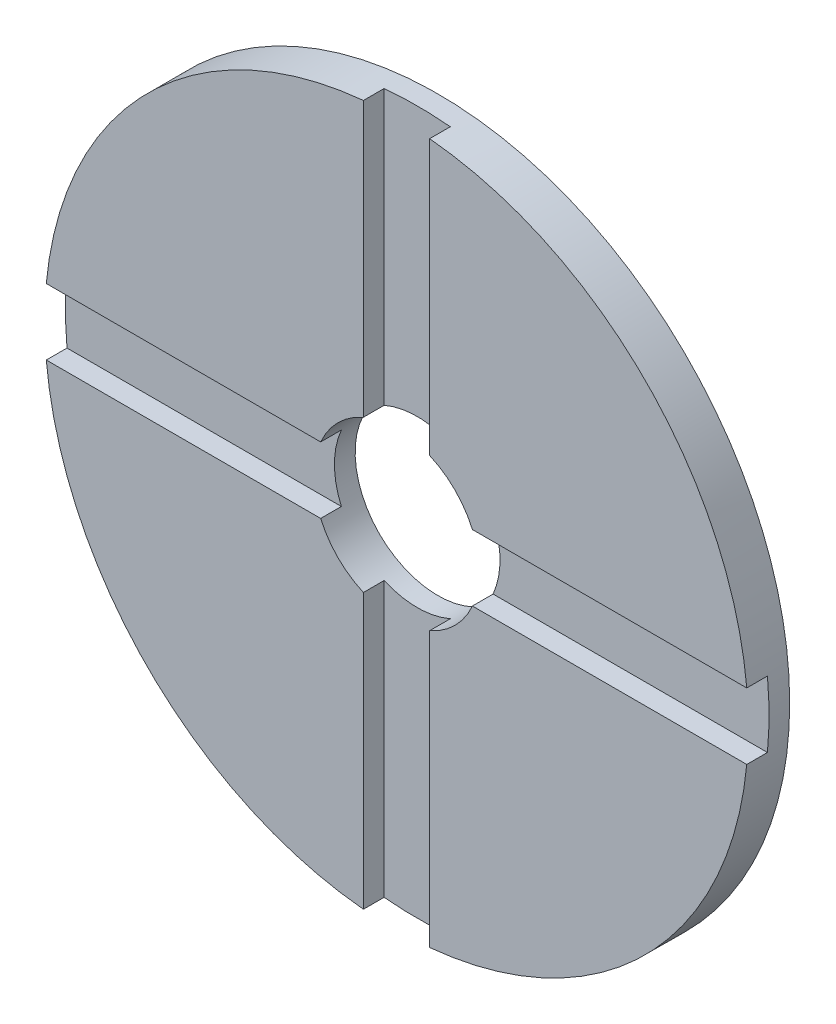
ISO-10303-21;
HEADER;
FILE_DESCRIPTION(('STEP AP214'),'2;1');
FILE_NAME('part.step','',(''),(''),'','','');
FILE_SCHEMA(('AUTOMOTIVE_DESIGN { 1 0 10303 214 1 1 1 1 }'));
ENDSEC;
DATA;
#1=APPLICATION_CONTEXT('core data for automotive mechanical design processes');
#2=APPLICATION_PROTOCOL_DEFINITION('international standard','automotive_design',2000,#1);
#3=PRODUCT_CONTEXT('',#1,'mechanical');
#4=PRODUCT('Part','Part','',(#3));
#5=PRODUCT_RELATED_PRODUCT_CATEGORY('part','',(#4));
#6=PRODUCT_DEFINITION_FORMATION('','',#4);
#7=PRODUCT_DEFINITION_CONTEXT('part definition',#1,'design');
#8=PRODUCT_DEFINITION('design','',#6,#7);
#9=PRODUCT_DEFINITION_SHAPE('','',#8);
#10=(LENGTH_UNIT() NAMED_UNIT(*) SI_UNIT(.MILLI.,.METRE.));
#11=(NAMED_UNIT(*) PLANE_ANGLE_UNIT() SI_UNIT($,.RADIAN.));
#12=(NAMED_UNIT(*) SI_UNIT($,.STERADIAN.) SOLID_ANGLE_UNIT());
#13=UNCERTAINTY_MEASURE_WITH_UNIT(LENGTH_MEASURE(1.E-05),#10,'distance_accuracy_value','');
#14=(GEOMETRIC_REPRESENTATION_CONTEXT(3) GLOBAL_UNCERTAINTY_ASSIGNED_CONTEXT((#13)) GLOBAL_UNIT_ASSIGNED_CONTEXT((#10,
#11,#12)) REPRESENTATION_CONTEXT('',''));
#15=CARTESIAN_POINT('',(0.,0.,0.));
#16=DIRECTION('',(0.,0.,1.));
#17=DIRECTION('',(1.,0.,0.));
#18=AXIS2_PLACEMENT_3D('',#15,#16,#17);
#19=CARTESIAN_POINT('',(0.,0.,10.));
#20=DIRECTION('',(0.,0.,-1.));
#21=DIRECTION('',(-1.,0.,0.));
#22=AXIS2_PLACEMENT_3D('',#19,#20,#21);
#23=CYLINDRICAL_SURFACE('',#22,20.);
#24=CARTESIAN_POINT('',(0.,0.,0.));
#25=DIRECTION('',(0.,0.,1.));
#26=DIRECTION('',(1.,0.,0.));
#27=AXIS2_PLACEMENT_3D('',#24,#25,#26);
#28=CIRCLE('',#27,20.);
#29=CARTESIAN_POINT('',(20.,0.,0.));
#30=VERTEX_POINT('',#29);
#31=EDGE_CURVE('E266',#30,#30,#28,.T.);
#32=ORIENTED_EDGE('',*,*,#31,.F.);
#33=EDGE_LOOP('',(#32));
#34=FACE_BOUND('',#33,.T.);
#35=CARTESIAN_POINT('',(0.,0.,10.));
#36=DIRECTION('',(0.,0.,1.));
#37=DIRECTION('',(1.,0.,0.));
#38=AXIS2_PLACEMENT_3D('',#35,#36,#37);
#39=CIRCLE('',#38,20.);
#40=CARTESIAN_POINT('',(-7.99999999999998,18.3303027798234,10.));
#41=VERTEX_POINT('',#40);
#42=CARTESIAN_POINT('',(-18.3303027798234,7.99999999999999,10.));
#43=VERTEX_POINT('',#42);
#44=EDGE_CURVE('E264',#41,#43,#39,.T.);
#45=ORIENTED_EDGE('',*,*,#44,.T.);
#46=DIRECTION('',(0.,0.,1.));
#47=VECTOR('',#46,1.);
#48=CARTESIAN_POINT('',(-18.3303027798234,7.99999999999999,5.));
#49=LINE('',#48,#47);
#50=CARTESIAN_POINT('',(-18.3303027798234,7.99999999999999,5.));
#51=VERTEX_POINT('',#50);
#52=EDGE_CURVE('E180',#51,#43,#49,.T.);
#53=ORIENTED_EDGE('',*,*,#52,.F.);
#54=CARTESIAN_POINT('',(0.,0.,5.));
#55=DIRECTION('',(0.,0.,1.));
#56=DIRECTION('',(1.,0.,0.));
#57=AXIS2_PLACEMENT_3D('',#54,#55,#56);
#58=CIRCLE('',#57,20.);
#59=CARTESIAN_POINT('',(-18.3303027798234,-7.99999999999999,5.));
#60=VERTEX_POINT('',#59);
#61=EDGE_CURVE('E163',#60,#51,#58,.F.);
#62=ORIENTED_EDGE('',*,*,#61,.F.);
#63=DIRECTION('',(0.,0.,1.));
#64=VECTOR('',#63,1.);
#65=CARTESIAN_POINT('',(-18.3303027798234,-7.99999999999999,5.));
#66=LINE('',#65,#64);
#67=CARTESIAN_POINT('',(-18.3303027798234,-7.99999999999999,10.));
#68=VERTEX_POINT('',#67);
#69=EDGE_CURVE('E159',#60,#68,#66,.T.);
#70=ORIENTED_EDGE('',*,*,#69,.T.);
#71=CARTESIAN_POINT('',(-7.99999999999998,-18.3303027798234,10.));
#72=VERTEX_POINT('',#71);
#73=EDGE_CURVE('E308',#68,#72,#39,.T.);
#74=ORIENTED_EDGE('',*,*,#73,.T.);
#75=DIRECTION('',(0.,0.,1.));
#76=VECTOR('',#75,1.);
#77=CARTESIAN_POINT('',(-7.99999999999998,-18.3303027798234,5.));
#78=LINE('',#77,#76);
#79=CARTESIAN_POINT('',(-7.99999999999998,-18.3303027798234,5.));
#80=VERTEX_POINT('',#79);
#81=EDGE_CURVE('E258',#80,#72,#78,.T.);
#82=ORIENTED_EDGE('',*,*,#81,.F.);
#83=CARTESIAN_POINT('',(0.,0.,5.));
#84=DIRECTION('',(0.,0.,1.));
#85=DIRECTION('',(1.,0.,0.));
#86=AXIS2_PLACEMENT_3D('',#83,#84,#85);
#87=CIRCLE('',#86,20.);
#88=CARTESIAN_POINT('',(8.00000000000001,-18.3303027798234,5.));
#89=VERTEX_POINT('',#88);
#90=EDGE_CURVE('E240',#89,#80,#87,.F.);
#91=ORIENTED_EDGE('',*,*,#90,.F.);
#92=DIRECTION('',(0.,0.,1.));
#93=VECTOR('',#92,1.);
#94=CARTESIAN_POINT('',(8.00000000000001,-18.3303027798234,5.));
#95=LINE('',#94,#93);
#96=CARTESIAN_POINT('',(8.00000000000001,-18.3303027798234,10.));
#97=VERTEX_POINT('',#96);
#98=EDGE_CURVE('E250',#89,#97,#95,.T.);
#99=ORIENTED_EDGE('',*,*,#98,.T.);
#100=CARTESIAN_POINT('',(18.3303027798234,-7.99999999999999,10.));
#101=VERTEX_POINT('',#100);
#102=EDGE_CURVE('E265',#97,#101,#39,.T.);
#103=ORIENTED_EDGE('',*,*,#102,.T.);
#104=DIRECTION('',(0.,0.,1.));
#105=VECTOR('',#104,1.);
#106=CARTESIAN_POINT('',(18.3303027798234,-7.99999999999999,5.));
#107=LINE('',#106,#105);
#108=CARTESIAN_POINT('',(18.3303027798234,-7.99999999999999,5.));
#109=VERTEX_POINT('',#108);
#110=EDGE_CURVE('E197',#109,#101,#107,.T.);
#111=ORIENTED_EDGE('',*,*,#110,.F.);
#112=CARTESIAN_POINT('',(0.,0.,5.));
#113=DIRECTION('',(0.,0.,1.));
#114=DIRECTION('',(1.,0.,0.));
#115=AXIS2_PLACEMENT_3D('',#112,#113,#114);
#116=CIRCLE('',#115,20.);
#117=CARTESIAN_POINT('',(18.3303027798234,7.99999999999999,5.));
#118=VERTEX_POINT('',#117);
#119=EDGE_CURVE('E185',#118,#109,#116,.F.);
#120=ORIENTED_EDGE('',*,*,#119,.F.);
#121=DIRECTION('',(0.,0.,1.));
#122=VECTOR('',#121,1.);
#123=CARTESIAN_POINT('',(18.3303027798234,7.99999999999999,5.));
#124=LINE('',#123,#122);
#125=CARTESIAN_POINT('',(18.3303027798234,7.99999999999999,10.));
#126=VERTEX_POINT('',#125);
#127=EDGE_CURVE('E203',#118,#126,#124,.T.);
#128=ORIENTED_EDGE('',*,*,#127,.T.);
#129=CARTESIAN_POINT('',(7.99999999999999,18.3303027798234,10.));
#130=VERTEX_POINT('',#129);
#131=EDGE_CURVE('E262',#126,#130,#39,.T.);
#132=ORIENTED_EDGE('',*,*,#131,.T.);
#133=DIRECTION('',(0.,0.,1.));
#134=VECTOR('',#133,1.);
#135=CARTESIAN_POINT('',(7.99999999999999,18.3303027798234,5.));
#136=LINE('',#135,#134);
#137=CARTESIAN_POINT('',(7.99999999999999,18.3303027798234,5.));
#138=VERTEX_POINT('',#137);
#139=EDGE_CURVE('E200',#138,#130,#136,.T.);
#140=ORIENTED_EDGE('',*,*,#139,.F.);
#141=CARTESIAN_POINT('',(0.,0.,5.));
#142=DIRECTION('',(0.,0.,1.));
#143=DIRECTION('',(1.,0.,0.));
#144=AXIS2_PLACEMENT_3D('',#141,#142,#143);
#145=CIRCLE('',#144,20.);
#146=CARTESIAN_POINT('',(-7.99999999999998,18.3303027798234,5.));
#147=VERTEX_POINT('',#146);
#148=EDGE_CURVE('E222',#147,#138,#145,.F.);
#149=ORIENTED_EDGE('',*,*,#148,.F.);
#150=DIRECTION('',(0.,0.,1.));
#151=VECTOR('',#150,1.);
#152=CARTESIAN_POINT('',(-7.99999999999998,18.3303027798234,5.));
#153=LINE('',#152,#151);
#154=EDGE_CURVE('E232',#147,#41,#153,.T.);
#155=ORIENTED_EDGE('',*,*,#154,.T.);
#156=EDGE_LOOP('',(#45,#53,#62,#70,#74,#82,#91,#99,#103,#111,#120,#128,#132,#140,#149,#155));
#157=FACE_BOUND('',#156,.T.);
#158=ADVANCED_FACE('F42',(#34,#157),#23,.F.);
#159=CARTESIAN_POINT('',(0.,0.,10.));
#160=DIRECTION('',(0.,0.,-1.));
#161=DIRECTION('',(-1.,0.,0.));
#162=AXIS2_PLACEMENT_3D('',#159,#160,#161);
#163=CYLINDRICAL_SURFACE('',#162,85.);
#164=CARTESIAN_POINT('',(0.,0.,0.));
#165=DIRECTION('',(0.,0.,1.));
#166=DIRECTION('',(1.,0.,0.));
#167=AXIS2_PLACEMENT_3D('',#164,#165,#166);
#168=CIRCLE('',#167,85.);
#169=CARTESIAN_POINT('',(85.,0.,0.));
#170=VERTEX_POINT('',#169);
#171=EDGE_CURVE('E45',#170,#170,#168,.T.);
#172=ORIENTED_EDGE('',*,*,#171,.T.);
#173=EDGE_LOOP('',(#172));
#174=FACE_BOUND('',#173,.T.);
#175=DIRECTION('',(0.,0.,1.));
#176=VECTOR('',#175,1.);
#177=CARTESIAN_POINT('',(-84.6226919921601,8.,5.));
#178=LINE('',#177,#176);
#179=CARTESIAN_POINT('',(-84.6226919921601,8.,5.));
#180=VERTEX_POINT('',#179);
#181=CARTESIAN_POINT('',(-84.6226919921601,8.,10.));
#182=VERTEX_POINT('',#181);
#183=EDGE_CURVE('E268',#180,#182,#178,.T.);
#184=ORIENTED_EDGE('',*,*,#183,.T.);
#185=CARTESIAN_POINT('',(0.,0.,10.));
#186=DIRECTION('',(0.,0.,1.));
#187=DIRECTION('',(1.,0.,0.));
#188=AXIS2_PLACEMENT_3D('',#185,#186,#187);
#189=CIRCLE('',#188,85.);
#190=CARTESIAN_POINT('',(-7.99999999999998,84.6226919921601,10.));
#191=VERTEX_POINT('',#190);
#192=EDGE_CURVE('E50',#191,#182,#189,.T.);
#193=ORIENTED_EDGE('',*,*,#192,.F.);
#194=DIRECTION('',(0.,0.,1.));
#195=VECTOR('',#194,1.);
#196=CARTESIAN_POINT('',(-7.99999999999998,84.6226919921601,5.));
#197=LINE('',#196,#195);
#198=CARTESIAN_POINT('',(-7.99999999999998,84.6226919921601,5.));
#199=VERTEX_POINT('',#198);
#200=EDGE_CURVE('E67',#199,#191,#197,.T.);
#201=ORIENTED_EDGE('',*,*,#200,.F.);
#202=CARTESIAN_POINT('',(0.,0.,5.));
#203=DIRECTION('',(0.,0.,1.));
#204=DIRECTION('',(1.,0.,0.));
#205=AXIS2_PLACEMENT_3D('',#202,#203,#204);
#206=CIRCLE('',#205,85.);
#207=CARTESIAN_POINT('',(7.99999999999998,84.6226919921601,5.));
#208=VERTEX_POINT('',#207);
#209=EDGE_CURVE('E215',#208,#199,#206,.T.);
#210=ORIENTED_EDGE('',*,*,#209,.F.);
#211=DIRECTION('',(0.,0.,1.));
#212=VECTOR('',#211,1.);
#213=CARTESIAN_POINT('',(7.99999999999998,84.6226919921601,5.));
#214=LINE('',#213,#212);
#215=CARTESIAN_POINT('',(7.99999999999998,84.6226919921601,10.));
#216=VERTEX_POINT('',#215);
#217=EDGE_CURVE('E225',#208,#216,#214,.T.);
#218=ORIENTED_EDGE('',*,*,#217,.T.);
#219=CARTESIAN_POINT('',(84.6226919921601,7.99999999999998,10.));
#220=VERTEX_POINT('',#219);
#221=EDGE_CURVE('E12',#220,#216,#189,.T.);
#222=ORIENTED_EDGE('',*,*,#221,.F.);
#223=DIRECTION('',(0.,0.,1.));
#224=VECTOR('',#223,1.);
#225=CARTESIAN_POINT('',(84.6226919921601,7.99999999999998,5.));
#226=LINE('',#225,#224);
#227=CARTESIAN_POINT('',(84.6226919921601,7.99999999999998,5.));
#228=VERTEX_POINT('',#227);
#229=EDGE_CURVE('E207',#228,#220,#226,.T.);
#230=ORIENTED_EDGE('',*,*,#229,.F.);
#231=CARTESIAN_POINT('',(0.,0.,5.));
#232=DIRECTION('',(0.,0.,1.));
#233=DIRECTION('',(1.,0.,0.));
#234=AXIS2_PLACEMENT_3D('',#231,#232,#233);
#235=CIRCLE('',#234,85.);
#236=CARTESIAN_POINT('',(84.6226919921601,-7.99999999999998,5.));
#237=VERTEX_POINT('',#236);
#238=EDGE_CURVE('E192',#237,#228,#235,.T.);
#239=ORIENTED_EDGE('',*,*,#238,.F.);
#240=DIRECTION('',(0.,0.,1.));
#241=VECTOR('',#240,1.);
#242=CARTESIAN_POINT('',(84.6226919921601,-7.99999999999998,5.));
#243=LINE('',#242,#241);
#244=CARTESIAN_POINT('',(84.6226919921601,-7.99999999999998,10.));
#245=VERTEX_POINT('',#244);
#246=EDGE_CURVE('E209',#237,#245,#243,.T.);
#247=ORIENTED_EDGE('',*,*,#246,.T.);
#248=CARTESIAN_POINT('',(8.00000000000002,-84.6226919921601,10.));
#249=VERTEX_POINT('',#248);
#250=EDGE_CURVE('E52',#249,#245,#189,.T.);
#251=ORIENTED_EDGE('',*,*,#250,.F.);
#252=DIRECTION('',(0.,0.,1.));
#253=VECTOR('',#252,1.);
#254=CARTESIAN_POINT('',(8.00000000000002,-84.6226919921601,5.));
#255=LINE('',#254,#253);
#256=CARTESIAN_POINT('',(8.00000000000002,-84.6226919921601,5.));
#257=VERTEX_POINT('',#256);
#258=EDGE_CURVE('E229',#257,#249,#255,.T.);
#259=ORIENTED_EDGE('',*,*,#258,.F.);
#260=CARTESIAN_POINT('',(0.,0.,5.));
#261=DIRECTION('',(0.,0.,1.));
#262=DIRECTION('',(1.,0.,0.));
#263=AXIS2_PLACEMENT_3D('',#260,#261,#262);
#264=CIRCLE('',#263,85.);
#265=CARTESIAN_POINT('',(-7.99999999999998,-84.6226919921601,5.));
#266=VERTEX_POINT('',#265);
#267=EDGE_CURVE('E247',#266,#257,#264,.T.);
#268=ORIENTED_EDGE('',*,*,#267,.F.);
#269=DIRECTION('',(0.,0.,1.));
#270=VECTOR('',#269,1.);
#271=CARTESIAN_POINT('',(-7.99999999999998,-84.6226919921601,5.));
#272=LINE('',#271,#270);
#273=CARTESIAN_POINT('',(-7.99999999999998,-84.6226919921601,10.));
#274=VERTEX_POINT('',#273);
#275=EDGE_CURVE('E256',#266,#274,#272,.T.);
#276=ORIENTED_EDGE('',*,*,#275,.T.);
#277=CARTESIAN_POINT('',(-84.6226919921601,-8.,10.));
#278=VERTEX_POINT('',#277);
#279=EDGE_CURVE('E178',#278,#274,#189,.T.);
#280=ORIENTED_EDGE('',*,*,#279,.F.);
#281=DIRECTION('',(0.,0.,1.));
#282=VECTOR('',#281,1.);
#283=CARTESIAN_POINT('',(-84.6226919921601,-8.,5.));
#284=LINE('',#283,#282);
#285=CARTESIAN_POINT('',(-84.6226919921601,-8.,5.));
#286=VERTEX_POINT('',#285);
#287=EDGE_CURVE('E59',#286,#278,#284,.T.);
#288=ORIENTED_EDGE('',*,*,#287,.F.);
#289=CARTESIAN_POINT('',(0.,0.,5.));
#290=DIRECTION('',(0.,0.,1.));
#291=DIRECTION('',(1.,0.,0.));
#292=AXIS2_PLACEMENT_3D('',#289,#290,#291);
#293=CIRCLE('',#292,85.);
#294=EDGE_CURVE('E164',#180,#286,#293,.T.);
#295=ORIENTED_EDGE('',*,*,#294,.F.);
#296=EDGE_LOOP('',(#184,#193,#201,#210,#218,#222,#230,#239,#247,#251,#259,#268,#276,#280,#288,#295));
#297=FACE_BOUND('',#296,.T.);
#298=ADVANCED_FACE('F175',(#174,#297),#163,.T.);
#299=CARTESIAN_POINT('',(0.,0.,10.));
#300=DIRECTION('',(0.,0.,1.));
#301=DIRECTION('',(1.,0.,0.));
#302=AXIS2_PLACEMENT_3D('',#299,#300,#301);
#303=PLANE('',#302);
#304=ORIENTED_EDGE('',*,*,#192,.T.);
#305=DIRECTION('',(1.,0.,0.));
#306=VECTOR('',#305,1.);
#307=CARTESIAN_POINT('',(0.,7.99999999999999,10.));
#308=LINE('',#307,#306);
#309=EDGE_CURVE('E172',#182,#43,#308,.T.);
#310=ORIENTED_EDGE('',*,*,#309,.T.);
#311=ORIENTED_EDGE('',*,*,#44,.F.);
#312=DIRECTION('',(0.,-1.,0.));
#313=VECTOR('',#312,1.);
#314=CARTESIAN_POINT('',(-7.99999999999998,0.,10.));
#315=LINE('',#314,#313);
#316=EDGE_CURVE('E216',#191,#41,#315,.T.);
#317=ORIENTED_EDGE('',*,*,#316,.F.);
#318=EDGE_LOOP('',(#304,#310,#311,#317));
#319=FACE_BOUND('',#318,.T.);
#320=ADVANCED_FACE('F286',(#319),#303,.T.);
#321=ORIENTED_EDGE('',*,*,#131,.F.);
#322=DIRECTION('',(1.,0.,0.));
#323=VECTOR('',#322,1.);
#324=CARTESIAN_POINT('',(0.,7.99999999999999,10.));
#325=LINE('',#324,#323);
#326=EDGE_CURVE('E189',#126,#220,#325,.T.);
#327=ORIENTED_EDGE('',*,*,#326,.T.);
#328=ORIENTED_EDGE('',*,*,#221,.T.);
#329=DIRECTION('',(0.,-1.,0.));
#330=VECTOR('',#329,1.);
#331=CARTESIAN_POINT('',(8.,0.,10.));
#332=LINE('',#331,#330);
#333=EDGE_CURVE('E226',#216,#130,#332,.T.);
#334=ORIENTED_EDGE('',*,*,#333,.T.);
#335=EDGE_LOOP('',(#321,#327,#328,#334));
#336=FACE_BOUND('',#335,.T.);
#337=ADVANCED_FACE('F340',(#336),#303,.T.);
#338=DIRECTION('',(1.,0.,0.));
#339=VECTOR('',#338,1.);
#340=CARTESIAN_POINT('',(0.,-7.99999999999999,10.));
#341=LINE('',#340,#339);
#342=EDGE_CURVE('E198',#101,#245,#341,.T.);
#343=ORIENTED_EDGE('',*,*,#342,.F.);
#344=ORIENTED_EDGE('',*,*,#102,.F.);
#345=DIRECTION('',(0.,-1.,0.));
#346=VECTOR('',#345,1.);
#347=CARTESIAN_POINT('',(8.,0.,10.));
#348=LINE('',#347,#346);
#349=EDGE_CURVE('E251',#97,#249,#348,.T.);
#350=ORIENTED_EDGE('',*,*,#349,.T.);
#351=ORIENTED_EDGE('',*,*,#250,.T.);
#352=EDGE_LOOP('',(#343,#344,#350,#351));
#353=FACE_BOUND('',#352,.T.);
#354=ADVANCED_FACE('F293',(#353),#303,.T.);
#355=DIRECTION('',(1.,0.,0.));
#356=VECTOR('',#355,1.);
#357=CARTESIAN_POINT('',(0.,-7.99999999999999,10.));
#358=LINE('',#357,#356);
#359=EDGE_CURVE('E206',#278,#68,#358,.T.);
#360=ORIENTED_EDGE('',*,*,#359,.F.);
#361=ORIENTED_EDGE('',*,*,#279,.T.);
#362=DIRECTION('',(0.,-1.,0.));
#363=VECTOR('',#362,1.);
#364=CARTESIAN_POINT('',(-7.99999999999998,0.,10.));
#365=LINE('',#364,#363);
#366=EDGE_CURVE('E241',#72,#274,#365,.T.);
#367=ORIENTED_EDGE('',*,*,#366,.F.);
#368=ORIENTED_EDGE('',*,*,#73,.F.);
#369=EDGE_LOOP('',(#360,#361,#367,#368));
#370=FACE_BOUND('',#369,.T.);
#371=ADVANCED_FACE('F312',(#370),#303,.T.);
#372=CARTESIAN_POINT('',(0.,0.,0.));
#373=DIRECTION('',(0.,0.,1.));
#374=DIRECTION('',(1.,0.,0.));
#375=AXIS2_PLACEMENT_3D('',#372,#373,#374);
#376=PLANE('',#375);
#377=ORIENTED_EDGE('',*,*,#31,.T.);
#378=EDGE_LOOP('',(#377));
#379=FACE_BOUND('',#378,.T.);
#380=ORIENTED_EDGE('',*,*,#171,.F.);
#381=EDGE_LOOP('',(#380));
#382=FACE_BOUND('',#381,.T.);
#383=ADVANCED_FACE('F321',(#379,#382),#376,.F.);
#384=CARTESIAN_POINT('',(8.,0.,5.));
#385=DIRECTION('',(-1.,0.,0.));
#386=DIRECTION('',(0.,-1.,0.));
#387=AXIS2_PLACEMENT_3D('',#384,#385,#386);
#388=PLANE('',#387);
#389=ORIENTED_EDGE('',*,*,#349,.F.);
#390=ORIENTED_EDGE('',*,*,#98,.F.);
#391=DIRECTION('',(0.,-1.,0.));
#392=VECTOR('',#391,1.);
#393=CARTESIAN_POINT('',(8.,0.,5.));
#394=LINE('',#393,#392);
#395=EDGE_CURVE('E238',#89,#257,#394,.T.);
#396=ORIENTED_EDGE('',*,*,#395,.T.);
#397=ORIENTED_EDGE('',*,*,#258,.T.);
#398=EDGE_LOOP('',(#389,#390,#396,#397));
#399=FACE_BOUND('',#398,.T.);
#400=ADVANCED_FACE('F319',(#399),#388,.T.);
#401=CARTESIAN_POINT('',(-7.99999999999998,0.,5.));
#402=DIRECTION('',(-1.,0.,0.));
#403=DIRECTION('',(0.,0.,1.));
#404=AXIS2_PLACEMENT_3D('',#401,#402,#403);
#405=PLANE('',#404);
#406=ORIENTED_EDGE('',*,*,#366,.T.);
#407=ORIENTED_EDGE('',*,*,#275,.F.);
#408=DIRECTION('',(0.,-1.,0.));
#409=VECTOR('',#408,1.);
#410=CARTESIAN_POINT('',(-7.99999999999998,0.,5.));
#411=LINE('',#410,#409);
#412=EDGE_CURVE('E244',#80,#266,#411,.T.);
#413=ORIENTED_EDGE('',*,*,#412,.F.);
#414=ORIENTED_EDGE('',*,*,#81,.T.);
#415=EDGE_LOOP('',(#406,#407,#413,#414));
#416=FACE_BOUND('',#415,.T.);
#417=ADVANCED_FACE('F314',(#416),#405,.F.);
#418=CARTESIAN_POINT('',(0.,0.,5.));
#419=DIRECTION('',(0.,0.,1.));
#420=DIRECTION('',(1.,0.,0.));
#421=AXIS2_PLACEMENT_3D('',#418,#419,#420);
#422=PLANE('',#421);
#423=ORIENTED_EDGE('',*,*,#395,.F.);
#424=ORIENTED_EDGE('',*,*,#90,.T.);
#425=ORIENTED_EDGE('',*,*,#412,.T.);
#426=ORIENTED_EDGE('',*,*,#267,.T.);
#427=EDGE_LOOP('',(#423,#424,#425,#426));
#428=FACE_BOUND('',#427,.T.);
#429=ADVANCED_FACE('F317',(#428),#422,.T.);
#430=CARTESIAN_POINT('',(8.,0.,5.));
#431=DIRECTION('',(-1.,0.,0.));
#432=DIRECTION('',(0.,-1.,0.));
#433=AXIS2_PLACEMENT_3D('',#430,#431,#432);
#434=PLANE('',#433);
#435=ORIENTED_EDGE('',*,*,#333,.F.);
#436=ORIENTED_EDGE('',*,*,#217,.F.);
#437=DIRECTION('',(0.,-1.,0.));
#438=VECTOR('',#437,1.);
#439=CARTESIAN_POINT('',(8.,0.,5.));
#440=LINE('',#439,#438);
#441=EDGE_CURVE('E213',#208,#138,#440,.T.);
#442=ORIENTED_EDGE('',*,*,#441,.T.);
#443=ORIENTED_EDGE('',*,*,#139,.T.);
#444=EDGE_LOOP('',(#435,#436,#442,#443));
#445=FACE_BOUND('',#444,.T.);
#446=ADVANCED_FACE('F386',(#445),#434,.T.);
#447=CARTESIAN_POINT('',(-7.99999999999998,0.,5.));
#448=DIRECTION('',(-1.,0.,0.));
#449=DIRECTION('',(0.,0.,1.));
#450=AXIS2_PLACEMENT_3D('',#447,#448,#449);
#451=PLANE('',#450);
#452=ORIENTED_EDGE('',*,*,#316,.T.);
#453=ORIENTED_EDGE('',*,*,#154,.F.);
#454=DIRECTION('',(0.,-1.,0.));
#455=VECTOR('',#454,1.);
#456=CARTESIAN_POINT('',(-7.99999999999998,0.,5.));
#457=LINE('',#456,#455);
#458=EDGE_CURVE('E219',#199,#147,#457,.T.);
#459=ORIENTED_EDGE('',*,*,#458,.F.);
#460=ORIENTED_EDGE('',*,*,#200,.T.);
#461=EDGE_LOOP('',(#452,#453,#459,#460));
#462=FACE_BOUND('',#461,.T.);
#463=ADVANCED_FACE('F394',(#462),#451,.F.);
#464=CARTESIAN_POINT('',(0.,0.,5.));
#465=DIRECTION('',(0.,0.,1.));
#466=DIRECTION('',(1.,0.,0.));
#467=AXIS2_PLACEMENT_3D('',#464,#465,#466);
#468=PLANE('',#467);
#469=ORIENTED_EDGE('',*,*,#441,.F.);
#470=ORIENTED_EDGE('',*,*,#209,.T.);
#471=ORIENTED_EDGE('',*,*,#458,.T.);
#472=ORIENTED_EDGE('',*,*,#148,.T.);
#473=EDGE_LOOP('',(#469,#470,#471,#472));
#474=FACE_BOUND('',#473,.T.);
#475=ADVANCED_FACE('F403',(#474),#468,.T.);
#476=CARTESIAN_POINT('',(0.,7.99999999999999,5.));
#477=DIRECTION('',(0.,-1.,0.));
#478=DIRECTION('',(1.,0.,0.));
#479=AXIS2_PLACEMENT_3D('',#476,#477,#478);
#480=PLANE('',#479);
#481=ORIENTED_EDGE('',*,*,#326,.F.);
#482=ORIENTED_EDGE('',*,*,#127,.F.);
#483=DIRECTION('',(1.,0.,0.));
#484=VECTOR('',#483,1.);
#485=CARTESIAN_POINT('',(0.,7.99999999999999,5.));
#486=LINE('',#485,#484);
#487=EDGE_CURVE('E195',#118,#228,#486,.T.);
#488=ORIENTED_EDGE('',*,*,#487,.T.);
#489=ORIENTED_EDGE('',*,*,#229,.T.);
#490=EDGE_LOOP('',(#481,#482,#488,#489));
#491=FACE_BOUND('',#490,.T.);
#492=ADVANCED_FACE('F411',(#491),#480,.T.);
#493=CARTESIAN_POINT('',(0.,-7.99999999999999,5.));
#494=DIRECTION('',(0.,-1.,0.));
#495=DIRECTION('',(1.,0.,0.));
#496=AXIS2_PLACEMENT_3D('',#493,#494,#495);
#497=PLANE('',#496);
#498=ORIENTED_EDGE('',*,*,#342,.T.);
#499=ORIENTED_EDGE('',*,*,#246,.F.);
#500=DIRECTION('',(1.,0.,0.));
#501=VECTOR('',#500,1.);
#502=CARTESIAN_POINT('',(0.,-7.99999999999999,5.));
#503=LINE('',#502,#501);
#504=EDGE_CURVE('E188',#109,#237,#503,.T.);
#505=ORIENTED_EDGE('',*,*,#504,.F.);
#506=ORIENTED_EDGE('',*,*,#110,.T.);
#507=EDGE_LOOP('',(#498,#499,#505,#506));
#508=FACE_BOUND('',#507,.T.);
#509=ADVANCED_FACE('F301',(#508),#497,.F.);
#510=CARTESIAN_POINT('',(0.,0.,5.));
#511=DIRECTION('',(0.,0.,1.));
#512=DIRECTION('',(1.,0.,0.));
#513=AXIS2_PLACEMENT_3D('',#510,#511,#512);
#514=PLANE('',#513);
#515=ORIENTED_EDGE('',*,*,#119,.T.);
#516=ORIENTED_EDGE('',*,*,#504,.T.);
#517=ORIENTED_EDGE('',*,*,#238,.T.);
#518=ORIENTED_EDGE('',*,*,#487,.F.);
#519=EDGE_LOOP('',(#515,#516,#517,#518));
#520=FACE_BOUND('',#519,.T.);
#521=ADVANCED_FACE('F303',(#520),#514,.T.);
#522=CARTESIAN_POINT('',(0.,7.99999999999999,5.));
#523=DIRECTION('',(0.,-1.,0.));
#524=DIRECTION('',(1.,0.,0.));
#525=AXIS2_PLACEMENT_3D('',#522,#523,#524);
#526=PLANE('',#525);
#527=ORIENTED_EDGE('',*,*,#309,.F.);
#528=ORIENTED_EDGE('',*,*,#183,.F.);
#529=DIRECTION('',(1.,0.,0.));
#530=VECTOR('',#529,1.);
#531=CARTESIAN_POINT('',(0.,7.99999999999999,5.));
#532=LINE('',#531,#530);
#533=EDGE_CURVE('E169',#180,#51,#532,.T.);
#534=ORIENTED_EDGE('',*,*,#533,.T.);
#535=ORIENTED_EDGE('',*,*,#52,.T.);
#536=EDGE_LOOP('',(#527,#528,#534,#535));
#537=FACE_BOUND('',#536,.T.);
#538=ADVANCED_FACE('F284',(#537),#526,.T.);
#539=CARTESIAN_POINT('',(0.,-7.99999999999999,5.));
#540=DIRECTION('',(0.,-1.,0.));
#541=DIRECTION('',(1.,0.,0.));
#542=AXIS2_PLACEMENT_3D('',#539,#540,#541);
#543=PLANE('',#542);
#544=ORIENTED_EDGE('',*,*,#359,.T.);
#545=ORIENTED_EDGE('',*,*,#69,.F.);
#546=DIRECTION('',(1.,0.,0.));
#547=VECTOR('',#546,1.);
#548=CARTESIAN_POINT('',(0.,-7.99999999999999,5.));
#549=LINE('',#548,#547);
#550=EDGE_CURVE('E155',#286,#60,#549,.T.);
#551=ORIENTED_EDGE('',*,*,#550,.F.);
#552=ORIENTED_EDGE('',*,*,#287,.T.);
#553=EDGE_LOOP('',(#544,#545,#551,#552));
#554=FACE_BOUND('',#553,.T.);
#555=ADVANCED_FACE('F157',(#554),#543,.F.);
#556=CARTESIAN_POINT('',(0.,0.,5.));
#557=DIRECTION('',(0.,0.,1.));
#558=DIRECTION('',(1.,0.,0.));
#559=AXIS2_PLACEMENT_3D('',#556,#557,#558);
#560=PLANE('',#559);
#561=ORIENTED_EDGE('',*,*,#294,.T.);
#562=ORIENTED_EDGE('',*,*,#550,.T.);
#563=ORIENTED_EDGE('',*,*,#61,.T.);
#564=ORIENTED_EDGE('',*,*,#533,.F.);
#565=EDGE_LOOP('',(#561,#562,#563,#564));
#566=FACE_BOUND('',#565,.T.);
#567=ADVANCED_FACE('F168',(#566),#560,.T.);
#568=CLOSED_SHELL('',(#158,#298,#320,#337,#354,#371,#383,#400,#417,#429,#446,#463,#475,#492,
#509,#521,#538,#555,#567));
#569=MANIFOLD_SOLID_BREP('B2',#568);
#570=ADVANCED_BREP_SHAPE_REPRESENTATION('',(#18,#569),#14);
#571=SHAPE_DEFINITION_REPRESENTATION(#9,#570);
ENDSEC;
END-ISO-10303-21;
